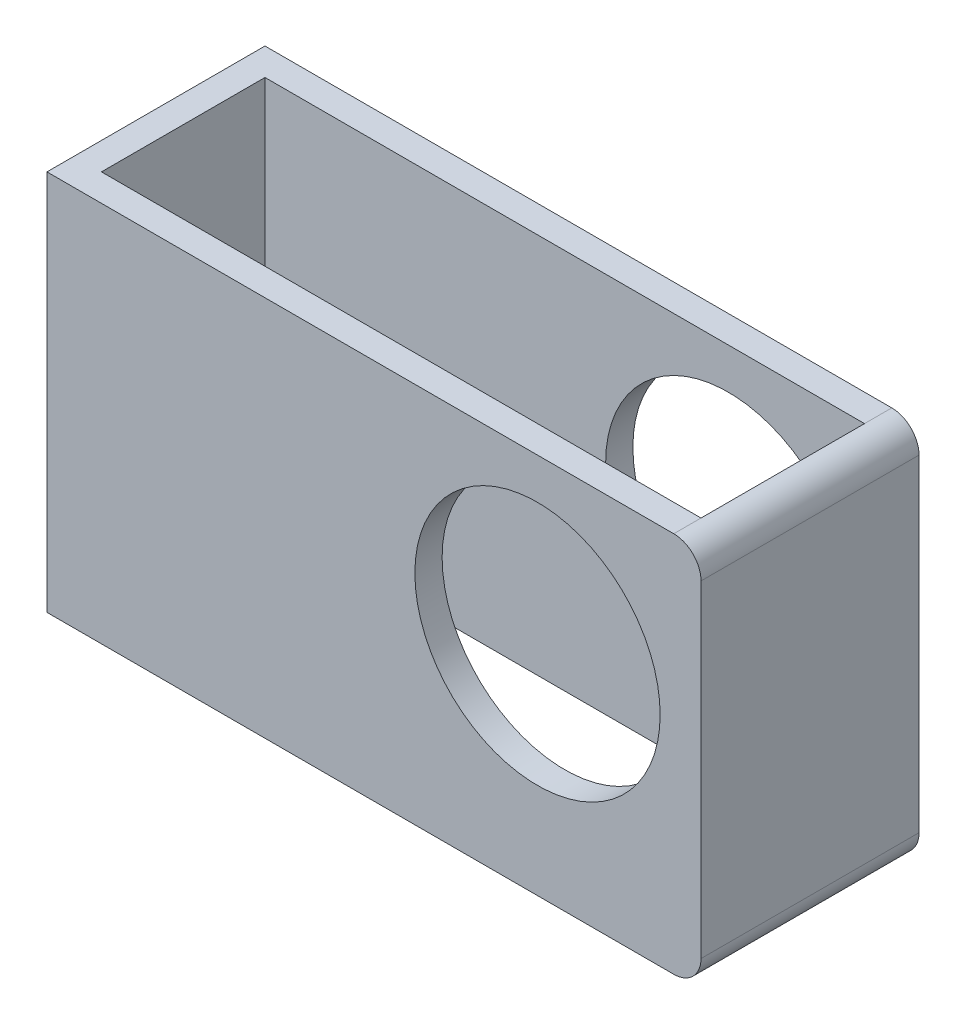
ISO-10303-21;
HEADER;
FILE_DESCRIPTION(('STEP AP214'),'2;1');
FILE_NAME('part.step','',(''),(''),'','','');
FILE_SCHEMA(('AUTOMOTIVE_DESIGN { 1 0 10303 214 1 1 1 1 }'));
ENDSEC;
DATA;
#1=APPLICATION_CONTEXT('core data for automotive mechanical design processes');
#2=APPLICATION_PROTOCOL_DEFINITION('international standard','automotive_design',2000,#1);
#3=PRODUCT_CONTEXT('',#1,'mechanical');
#4=PRODUCT('Part','Part','',(#3));
#5=PRODUCT_RELATED_PRODUCT_CATEGORY('part','',(#4));
#6=PRODUCT_DEFINITION_FORMATION('','',#4);
#7=PRODUCT_DEFINITION_CONTEXT('part definition',#1,'design');
#8=PRODUCT_DEFINITION('design','',#6,#7);
#9=PRODUCT_DEFINITION_SHAPE('','',#8);
#10=(LENGTH_UNIT() NAMED_UNIT(*) SI_UNIT(.MILLI.,.METRE.));
#11=(NAMED_UNIT(*) PLANE_ANGLE_UNIT() SI_UNIT($,.RADIAN.));
#12=(NAMED_UNIT(*) SI_UNIT($,.STERADIAN.) SOLID_ANGLE_UNIT());
#13=UNCERTAINTY_MEASURE_WITH_UNIT(LENGTH_MEASURE(1.E-05),#10,'distance_accuracy_value','');
#14=(GEOMETRIC_REPRESENTATION_CONTEXT(3) GLOBAL_UNCERTAINTY_ASSIGNED_CONTEXT((#13)) GLOBAL_UNIT_ASSIGNED_CONTEXT((#10,
#11,#12)) REPRESENTATION_CONTEXT('',''));
#15=CARTESIAN_POINT('',(0.,0.,0.));
#16=DIRECTION('',(0.,0.,1.));
#17=DIRECTION('',(1.,0.,0.));
#18=AXIS2_PLACEMENT_3D('',#15,#16,#17);
#19=CARTESIAN_POINT('',(-38.1,22.225,12.7));
#20=DIRECTION('',(1.,0.,0.));
#21=DIRECTION('',(0.,0.,-1.));
#22=AXIS2_PLACEMENT_3D('',#19,#20,#21);
#23=PLANE('',#22);
#24=CARTESIAN_POINT('',(-38.1,6.35000000000001,0.));
#25=DIRECTION('',(-1.,0.,0.));
#26=DIRECTION('',(0.,0.,1.));
#27=AXIS2_PLACEMENT_3D('',#24,#25,#26);
#28=CIRCLE('',#27,3.17499999999999);
#29=CARTESIAN_POINT('',(-38.1,6.35000000000001,3.17499999999999));
#30=VERTEX_POINT('',#29);
#31=EDGE_CURVE('E253',#30,#30,#28,.T.);
#32=ORIENTED_EDGE('',*,*,#31,.F.);
#33=EDGE_LOOP('',(#32));
#34=FACE_BOUND('',#33,.T.);
#35=DIRECTION('',(0.,-1.,0.));
#36=VECTOR('',#35,1.);
#37=CARTESIAN_POINT('',(-38.1,22.225,-12.7));
#38=LINE('',#37,#36);
#39=CARTESIAN_POINT('',(-38.1,22.225,-12.7));
#40=VERTEX_POINT('',#39);
#41=CARTESIAN_POINT('',(-38.1,-22.225,-12.7));
#42=VERTEX_POINT('',#41);
#43=EDGE_CURVE('E182',#40,#42,#38,.T.);
#44=ORIENTED_EDGE('',*,*,#43,.T.);
#45=DIRECTION('',(0.,0.,-1.));
#46=VECTOR('',#45,1.);
#47=CARTESIAN_POINT('',(-38.1,-22.225,12.7));
#48=LINE('',#47,#46);
#49=CARTESIAN_POINT('',(-38.1,-22.225,12.7));
#50=VERTEX_POINT('',#49);
#51=EDGE_CURVE('E177',#50,#42,#48,.T.);
#52=ORIENTED_EDGE('',*,*,#51,.F.);
#53=DIRECTION('',(0.,-1.,0.));
#54=VECTOR('',#53,1.);
#55=CARTESIAN_POINT('',(-38.1,22.225,12.7));
#56=LINE('',#55,#54);
#57=CARTESIAN_POINT('',(-38.1,22.225,12.7));
#58=VERTEX_POINT('',#57);
#59=EDGE_CURVE('E172',#58,#50,#56,.T.);
#60=ORIENTED_EDGE('',*,*,#59,.F.);
#61=DIRECTION('',(0.,0.,-1.));
#62=VECTOR('',#61,1.);
#63=CARTESIAN_POINT('',(-38.1,22.225,12.7));
#64=LINE('',#63,#62);
#65=EDGE_CURVE('E188',#58,#40,#64,.T.);
#66=ORIENTED_EDGE('',*,*,#65,.T.);
#67=EDGE_LOOP('',(#44,#52,#60,#66));
#68=FACE_BOUND('',#67,.T.);
#69=CARTESIAN_POINT('',(-38.1,-12.7,0.));
#70=DIRECTION('',(-1.,0.,0.));
#71=DIRECTION('',(0.,0.,1.));
#72=AXIS2_PLACEMENT_3D('',#69,#70,#71);
#73=CIRCLE('',#72,3.17499999999999);
#74=CARTESIAN_POINT('',(-38.1,-12.7,3.17499999999999));
#75=VERTEX_POINT('',#74);
#76=EDGE_CURVE('E247',#75,#75,#73,.T.);
#77=ORIENTED_EDGE('',*,*,#76,.F.);
#78=EDGE_LOOP('',(#77));
#79=FACE_BOUND('',#78,.T.);
#80=ADVANCED_FACE('F35',(#34,#68,#79),#23,.F.);
#81=CARTESIAN_POINT('',(19.05,3.175,12.7));
#82=DIRECTION('',(0.,0.,-1.));
#83=DIRECTION('',(-1.,0.,0.));
#84=AXIS2_PLACEMENT_3D('',#81,#82,#83);
#85=CYLINDRICAL_SURFACE('',#84,14.2875);
#86=CARTESIAN_POINT('',(19.05,3.175,-9.525));
#87=DIRECTION('',(0.,0.,-1.));
#88=DIRECTION('',(-1.,0.,0.));
#89=AXIS2_PLACEMENT_3D('',#86,#87,#88);
#90=CIRCLE('',#89,14.2875);
#91=CARTESIAN_POINT('',(4.7625,3.175,-9.525));
#92=VERTEX_POINT('',#91);
#93=EDGE_CURVE('E156',#92,#92,#90,.T.);
#94=ORIENTED_EDGE('',*,*,#93,.F.);
#95=EDGE_LOOP('',(#94));
#96=FACE_BOUND('',#95,.T.);
#97=CARTESIAN_POINT('',(19.05,3.175,-12.7));
#98=DIRECTION('',(0.,0.,1.));
#99=DIRECTION('',(1.,0.,0.));
#100=AXIS2_PLACEMENT_3D('',#97,#98,#99);
#101=CIRCLE('',#100,14.2875);
#102=CARTESIAN_POINT('',(33.3375,3.175,-12.7));
#103=VERTEX_POINT('',#102);
#104=EDGE_CURVE('E159',#103,#103,#101,.T.);
#105=ORIENTED_EDGE('',*,*,#104,.F.);
#106=EDGE_LOOP('',(#105));
#107=FACE_BOUND('',#106,.T.);
#108=ADVANCED_FACE('F242',(#96,#107),#85,.F.);
#109=CARTESIAN_POINT('',(0.,0.,12.7));
#110=DIRECTION('',(0.,0.,1.));
#111=DIRECTION('',(1.,0.,0.));
#112=AXIS2_PLACEMENT_3D('',#109,#110,#111);
#113=PLANE('',#112);
#114=DIRECTION('',(0.,1.,0.));
#115=VECTOR('',#114,1.);
#116=CARTESIAN_POINT('',(38.1,22.225,12.7));
#117=LINE('',#116,#115);
#118=CARTESIAN_POINT('',(38.1,-19.05,12.7));
#119=VERTEX_POINT('',#118);
#120=CARTESIAN_POINT('',(38.1,19.05,12.7));
#121=VERTEX_POINT('',#120);
#122=EDGE_CURVE('E166',#119,#121,#117,.T.);
#123=ORIENTED_EDGE('',*,*,#122,.T.);
#124=CARTESIAN_POINT('',(34.925,19.05,12.7));
#125=DIRECTION('',(0.,0.,1.));
#126=DIRECTION('',(1.,0.,0.));
#127=AXIS2_PLACEMENT_3D('',#124,#125,#126);
#128=CIRCLE('',#127,3.175);
#129=CARTESIAN_POINT('',(34.925,22.225,12.7));
#130=VERTEX_POINT('',#129);
#131=EDGE_CURVE('E203',#121,#130,#128,.T.);
#132=ORIENTED_EDGE('',*,*,#131,.T.);
#133=DIRECTION('',(-1.,0.,0.));
#134=VECTOR('',#133,1.);
#135=CARTESIAN_POINT('',(-38.1,22.225,12.7));
#136=LINE('',#135,#134);
#137=EDGE_CURVE('E169',#130,#58,#136,.T.);
#138=ORIENTED_EDGE('',*,*,#137,.T.);
#139=ORIENTED_EDGE('',*,*,#59,.T.);
#140=DIRECTION('',(1.,0.,0.));
#141=VECTOR('',#140,1.);
#142=CARTESIAN_POINT('',(-38.1,-22.225,12.7));
#143=LINE('',#142,#141);
#144=CARTESIAN_POINT('',(34.925,-22.225,12.7));
#145=VERTEX_POINT('',#144);
#146=EDGE_CURVE('E174',#50,#145,#143,.T.);
#147=ORIENTED_EDGE('',*,*,#146,.T.);
#148=CARTESIAN_POINT('',(34.925,-19.05,12.7));
#149=DIRECTION('',(0.,0.,1.));
#150=DIRECTION('',(1.,0.,0.));
#151=AXIS2_PLACEMENT_3D('',#148,#149,#150);
#152=CIRCLE('',#151,3.175);
#153=EDGE_CURVE('E202',#145,#119,#152,.T.);
#154=ORIENTED_EDGE('',*,*,#153,.T.);
#155=EDGE_LOOP('',(#123,#132,#138,#139,#147,#154));
#156=FACE_BOUND('',#155,.T.);
#157=CARTESIAN_POINT('',(19.05,3.175,12.7));
#158=DIRECTION('',(0.,0.,1.));
#159=DIRECTION('',(1.,0.,0.));
#160=AXIS2_PLACEMENT_3D('',#157,#158,#159);
#161=CIRCLE('',#160,14.2875);
#162=CARTESIAN_POINT('',(33.3375,3.175,12.7));
#163=VERTEX_POINT('',#162);
#164=EDGE_CURVE('E160',#163,#163,#161,.T.);
#165=ORIENTED_EDGE('',*,*,#164,.F.);
#166=EDGE_LOOP('',(#165));
#167=FACE_BOUND('',#166,.T.);
#168=ADVANCED_FACE('F213',(#156,#167),#113,.T.);
#169=CARTESIAN_POINT('',(0.,0.,-12.7));
#170=DIRECTION('',(0.,0.,1.));
#171=DIRECTION('',(1.,0.,0.));
#172=AXIS2_PLACEMENT_3D('',#169,#170,#171);
#173=PLANE('',#172);
#174=DIRECTION('',(-1.,0.,0.));
#175=VECTOR('',#174,1.);
#176=CARTESIAN_POINT('',(-38.1,22.225,-12.7));
#177=LINE('',#176,#175);
#178=CARTESIAN_POINT('',(34.925,22.225,-12.7));
#179=VERTEX_POINT('',#178);
#180=EDGE_CURVE('E180',#179,#40,#177,.T.);
#181=ORIENTED_EDGE('',*,*,#180,.F.);
#182=CARTESIAN_POINT('',(34.925,19.05,-12.7));
#183=DIRECTION('',(0.,0.,1.));
#184=DIRECTION('',(1.,0.,0.));
#185=AXIS2_PLACEMENT_3D('',#182,#183,#184);
#186=CIRCLE('',#185,3.175);
#187=CARTESIAN_POINT('',(38.1,19.05,-12.7));
#188=VERTEX_POINT('',#187);
#189=EDGE_CURVE('E195',#179,#188,#186,.F.);
#190=ORIENTED_EDGE('',*,*,#189,.T.);
#191=DIRECTION('',(0.,1.,0.));
#192=VECTOR('',#191,1.);
#193=CARTESIAN_POINT('',(38.1,22.225,-12.7));
#194=LINE('',#193,#192);
#195=CARTESIAN_POINT('',(38.1,-19.05,-12.7));
#196=VERTEX_POINT('',#195);
#197=EDGE_CURVE('E163',#196,#188,#194,.T.);
#198=ORIENTED_EDGE('',*,*,#197,.F.);
#199=CARTESIAN_POINT('',(34.925,-19.05,-12.7));
#200=DIRECTION('',(0.,0.,1.));
#201=DIRECTION('',(1.,0.,0.));
#202=AXIS2_PLACEMENT_3D('',#199,#200,#201);
#203=CIRCLE('',#202,3.175);
#204=CARTESIAN_POINT('',(34.925,-22.225,-12.7));
#205=VERTEX_POINT('',#204);
#206=EDGE_CURVE('E193',#196,#205,#203,.F.);
#207=ORIENTED_EDGE('',*,*,#206,.T.);
#208=DIRECTION('',(1.,0.,0.));
#209=VECTOR('',#208,1.);
#210=CARTESIAN_POINT('',(-38.1,-22.225,-12.7));
#211=LINE('',#210,#209);
#212=EDGE_CURVE('E170',#42,#205,#211,.T.);
#213=ORIENTED_EDGE('',*,*,#212,.F.);
#214=ORIENTED_EDGE('',*,*,#43,.F.);
#215=EDGE_LOOP('',(#181,#190,#198,#207,#213,#214));
#216=FACE_BOUND('',#215,.T.);
#217=ORIENTED_EDGE('',*,*,#104,.T.);
#218=EDGE_LOOP('',(#217));
#219=FACE_BOUND('',#218,.T.);
#220=ADVANCED_FACE('F226',(#216,#219),#173,.F.);
#221=CARTESIAN_POINT('',(38.1,22.225,12.7));
#222=DIRECTION('',(-1.,0.,0.));
#223=DIRECTION('',(0.,0.,1.));
#224=AXIS2_PLACEMENT_3D('',#221,#222,#223);
#225=PLANE('',#224);
#226=ORIENTED_EDGE('',*,*,#197,.T.);
#227=DIRECTION('',(0.,0.,-1.));
#228=VECTOR('',#227,1.);
#229=CARTESIAN_POINT('',(38.1,19.05,12.7));
#230=LINE('',#229,#228);
#231=EDGE_CURVE('E200',#188,#121,#230,.F.);
#232=ORIENTED_EDGE('',*,*,#231,.T.);
#233=ORIENTED_EDGE('',*,*,#122,.F.);
#234=DIRECTION('',(0.,0.,-1.));
#235=VECTOR('',#234,1.);
#236=CARTESIAN_POINT('',(38.1,-19.05,12.7));
#237=LINE('',#236,#235);
#238=EDGE_CURVE('E197',#119,#196,#237,.T.);
#239=ORIENTED_EDGE('',*,*,#238,.T.);
#240=EDGE_LOOP('',(#226,#232,#233,#239));
#241=FACE_BOUND('',#240,.T.);
#242=ADVANCED_FACE('F222',(#241),#225,.F.);
#243=CARTESIAN_POINT('',(-38.1,22.225,12.7));
#244=DIRECTION('',(0.,-1.,0.));
#245=DIRECTION('',(0.,0.,-1.));
#246=AXIS2_PLACEMENT_3D('',#243,#244,#245);
#247=PLANE('',#246);
#248=DIRECTION('',(0.,0.,-1.));
#249=VECTOR('',#248,1.);
#250=CARTESIAN_POINT('',(-34.925,22.225,9.525));
#251=LINE('',#250,#249);
#252=CARTESIAN_POINT('',(-34.925,22.225,9.525));
#253=VERTEX_POINT('',#252);
#254=CARTESIAN_POINT('',(-34.925,22.225,-9.525));
#255=VERTEX_POINT('',#254);
#256=EDGE_CURVE('E122',#253,#255,#251,.T.);
#257=ORIENTED_EDGE('',*,*,#256,.T.);
#258=DIRECTION('',(1.,0.,0.));
#259=VECTOR('',#258,1.);
#260=CARTESIAN_POINT('',(-34.925,22.225,-9.525));
#261=LINE('',#260,#259);
#262=CARTESIAN_POINT('',(34.925,22.225,-9.525));
#263=VERTEX_POINT('',#262);
#264=EDGE_CURVE('E127',#255,#263,#261,.T.);
#265=ORIENTED_EDGE('',*,*,#264,.T.);
#266=DIRECTION('',(0.,0.,-1.));
#267=VECTOR('',#266,1.);
#268=CARTESIAN_POINT('',(34.925,22.225,12.7));
#269=LINE('',#268,#267);
#270=EDGE_CURVE('E191',#263,#179,#269,.T.);
#271=ORIENTED_EDGE('',*,*,#270,.T.);
#272=ORIENTED_EDGE('',*,*,#180,.T.);
#273=ORIENTED_EDGE('',*,*,#65,.F.);
#274=ORIENTED_EDGE('',*,*,#137,.F.);
#275=CARTESIAN_POINT('',(34.925,22.225,9.525));
#276=VERTEX_POINT('',#275);
#277=EDGE_CURVE('E133',#130,#276,#269,.T.);
#278=ORIENTED_EDGE('',*,*,#277,.T.);
#279=DIRECTION('',(-1.,0.,0.));
#280=VECTOR('',#279,1.);
#281=CARTESIAN_POINT('',(34.925,22.225,9.525));
#282=LINE('',#281,#280);
#283=EDGE_CURVE('E50',#276,#253,#282,.T.);
#284=ORIENTED_EDGE('',*,*,#283,.T.);
#285=EDGE_LOOP('',(#257,#265,#271,#272,#273,#274,#278,#284));
#286=FACE_BOUND('',#285,.T.);
#287=ADVANCED_FACE('F130',(#286),#247,.F.);
#288=CARTESIAN_POINT('',(-38.1,-22.225,12.7));
#289=DIRECTION('',(0.,1.,0.));
#290=DIRECTION('',(0.,0.,1.));
#291=AXIS2_PLACEMENT_3D('',#288,#289,#290);
#292=PLANE('',#291);
#293=DIRECTION('',(0.,0.,-1.));
#294=VECTOR('',#293,1.);
#295=CARTESIAN_POINT('',(34.925,-22.225,12.7));
#296=LINE('',#295,#294);
#297=CARTESIAN_POINT('',(34.925,-22.225,-9.525));
#298=VERTEX_POINT('',#297);
#299=EDGE_CURVE('E11',#205,#298,#296,.F.);
#300=ORIENTED_EDGE('',*,*,#299,.T.);
#301=DIRECTION('',(1.,0.,0.));
#302=VECTOR('',#301,1.);
#303=CARTESIAN_POINT('',(-34.925,-22.225,-9.525));
#304=LINE('',#303,#302);
#305=CARTESIAN_POINT('',(-34.925,-22.225,-9.525));
#306=VERTEX_POINT('',#305);
#307=EDGE_CURVE('E58',#306,#298,#304,.T.);
#308=ORIENTED_EDGE('',*,*,#307,.F.);
#309=DIRECTION('',(0.,0.,-1.));
#310=VECTOR('',#309,1.);
#311=CARTESIAN_POINT('',(-34.925,-22.225,9.525));
#312=LINE('',#311,#310);
#313=CARTESIAN_POINT('',(-34.925,-22.225,9.525));
#314=VERTEX_POINT('',#313);
#315=EDGE_CURVE('E146',#314,#306,#312,.T.);
#316=ORIENTED_EDGE('',*,*,#315,.F.);
#317=DIRECTION('',(-1.,0.,0.));
#318=VECTOR('',#317,1.);
#319=CARTESIAN_POINT('',(34.925,-22.225,9.525));
#320=LINE('',#319,#318);
#321=CARTESIAN_POINT('',(34.925,-22.225,9.525));
#322=VERTEX_POINT('',#321);
#323=EDGE_CURVE('E114',#322,#314,#320,.T.);
#324=ORIENTED_EDGE('',*,*,#323,.F.);
#325=EDGE_CURVE('E43',#322,#145,#296,.F.);
#326=ORIENTED_EDGE('',*,*,#325,.T.);
#327=ORIENTED_EDGE('',*,*,#146,.F.);
#328=ORIENTED_EDGE('',*,*,#51,.T.);
#329=ORIENTED_EDGE('',*,*,#212,.T.);
#330=EDGE_LOOP('',(#300,#308,#316,#324,#326,#327,#328,#329));
#331=FACE_BOUND('',#330,.T.);
#332=ADVANCED_FACE('F209',(#331),#292,.F.);
#333=CARTESIAN_POINT('',(19.05,3.175,9.525));
#334=DIRECTION('',(0.,0.,1.));
#335=DIRECTION('',(1.,0.,0.));
#336=AXIS2_PLACEMENT_3D('',#333,#334,#335);
#337=CIRCLE('',#336,14.2875);
#338=CARTESIAN_POINT('',(33.3375,3.175,9.525));
#339=VERTEX_POINT('',#338);
#340=EDGE_CURVE('E151',#339,#339,#337,.T.);
#341=ORIENTED_EDGE('',*,*,#340,.F.);
#342=EDGE_LOOP('',(#341));
#343=FACE_BOUND('',#342,.T.);
#344=ORIENTED_EDGE('',*,*,#164,.T.);
#345=EDGE_LOOP('',(#344));
#346=FACE_BOUND('',#345,.T.);
#347=ADVANCED_FACE('F284',(#343,#346),#85,.F.);
#348=CARTESIAN_POINT('',(34.925,19.05,12.7));
#349=DIRECTION('',(0.,0.,-1.));
#350=DIRECTION('',(-1.,0.,0.));
#351=AXIS2_PLACEMENT_3D('',#348,#349,#350);
#352=CYLINDRICAL_SURFACE('',#351,3.175);
#353=ORIENTED_EDGE('',*,*,#131,.F.);
#354=ORIENTED_EDGE('',*,*,#231,.F.);
#355=ORIENTED_EDGE('',*,*,#189,.F.);
#356=ORIENTED_EDGE('',*,*,#270,.F.);
#357=DIRECTION('',(0.,0.,1.));
#358=VECTOR('',#357,1.);
#359=CARTESIAN_POINT('',(34.925,22.225,-9.525));
#360=LINE('',#359,#358);
#361=EDGE_CURVE('E134',#263,#276,#360,.T.);
#362=ORIENTED_EDGE('',*,*,#361,.T.);
#363=ORIENTED_EDGE('',*,*,#277,.F.);
#364=EDGE_LOOP('',(#353,#354,#355,#356,#362,#363));
#365=FACE_BOUND('',#364,.T.);
#366=ADVANCED_FACE('F233',(#365),#352,.T.);
#367=CARTESIAN_POINT('',(34.925,-19.05,12.7));
#368=DIRECTION('',(0.,0.,-1.));
#369=DIRECTION('',(-1.,0.,0.));
#370=AXIS2_PLACEMENT_3D('',#367,#368,#369);
#371=CYLINDRICAL_SURFACE('',#370,3.175);
#372=ORIENTED_EDGE('',*,*,#153,.F.);
#373=ORIENTED_EDGE('',*,*,#325,.F.);
#374=DIRECTION('',(0.,0.,1.));
#375=VECTOR('',#374,1.);
#376=CARTESIAN_POINT('',(34.925,-22.225,-9.525));
#377=LINE('',#376,#375);
#378=EDGE_CURVE('E141',#298,#322,#377,.T.);
#379=ORIENTED_EDGE('',*,*,#378,.F.);
#380=ORIENTED_EDGE('',*,*,#299,.F.);
#381=ORIENTED_EDGE('',*,*,#206,.F.);
#382=ORIENTED_EDGE('',*,*,#238,.F.);
#383=EDGE_LOOP('',(#372,#373,#379,#380,#381,#382));
#384=FACE_BOUND('',#383,.T.);
#385=ADVANCED_FACE('F37',(#384),#371,.T.);
#386=CARTESIAN_POINT('',(34.925,22.225,-9.525));
#387=DIRECTION('',(1.,0.,0.));
#388=DIRECTION('',(0.,0.,-1.));
#389=AXIS2_PLACEMENT_3D('',#386,#387,#388);
#390=PLANE('',#389);
#391=ORIENTED_EDGE('',*,*,#378,.T.);
#392=DIRECTION('',(0.,-1.,0.));
#393=VECTOR('',#392,1.);
#394=CARTESIAN_POINT('',(34.925,22.225,9.525));
#395=LINE('',#394,#393);
#396=EDGE_CURVE('E119',#276,#322,#395,.T.);
#397=ORIENTED_EDGE('',*,*,#396,.F.);
#398=ORIENTED_EDGE('',*,*,#361,.F.);
#399=DIRECTION('',(0.,-1.,0.));
#400=VECTOR('',#399,1.);
#401=CARTESIAN_POINT('',(34.925,22.225,-9.525));
#402=LINE('',#401,#400);
#403=EDGE_CURVE('E149',#263,#298,#402,.T.);
#404=ORIENTED_EDGE('',*,*,#403,.T.);
#405=EDGE_LOOP('',(#391,#397,#398,#404));
#406=FACE_BOUND('',#405,.T.);
#407=ADVANCED_FACE('F236',(#406),#390,.F.);
#408=CARTESIAN_POINT('',(-34.925,22.225,-9.525));
#409=DIRECTION('',(0.,0.,-1.));
#410=DIRECTION('',(-1.,0.,0.));
#411=AXIS2_PLACEMENT_3D('',#408,#409,#410);
#412=PLANE('',#411);
#413=ORIENTED_EDGE('',*,*,#93,.T.);
#414=EDGE_LOOP('',(#413));
#415=FACE_BOUND('',#414,.T.);
#416=ORIENTED_EDGE('',*,*,#307,.T.);
#417=ORIENTED_EDGE('',*,*,#403,.F.);
#418=ORIENTED_EDGE('',*,*,#264,.F.);
#419=DIRECTION('',(0.,-1.,0.));
#420=VECTOR('',#419,1.);
#421=CARTESIAN_POINT('',(-34.925,22.225,-9.525));
#422=LINE('',#421,#420);
#423=EDGE_CURVE('E118',#255,#306,#422,.T.);
#424=ORIENTED_EDGE('',*,*,#423,.T.);
#425=EDGE_LOOP('',(#416,#417,#418,#424));
#426=FACE_BOUND('',#425,.T.);
#427=ADVANCED_FACE('F237',(#415,#426),#412,.F.);
#428=CARTESIAN_POINT('',(-34.925,22.225,9.525));
#429=DIRECTION('',(-1.,0.,0.));
#430=DIRECTION('',(0.,0.,1.));
#431=AXIS2_PLACEMENT_3D('',#428,#429,#430);
#432=PLANE('',#431);
#433=CARTESIAN_POINT('',(-34.925,6.35000000000001,0.));
#434=DIRECTION('',(-1.,0.,0.));
#435=DIRECTION('',(0.,0.,1.));
#436=AXIS2_PLACEMENT_3D('',#433,#434,#435);
#437=CIRCLE('',#436,3.17499999999999);
#438=CARTESIAN_POINT('',(-34.925,6.35000000000001,3.17499999999999));
#439=VERTEX_POINT('',#438);
#440=EDGE_CURVE('E249',#439,#439,#437,.T.);
#441=ORIENTED_EDGE('',*,*,#440,.T.);
#442=EDGE_LOOP('',(#441));
#443=FACE_BOUND('',#442,.T.);
#444=CARTESIAN_POINT('',(-34.925,-12.7,0.));
#445=DIRECTION('',(-1.,0.,0.));
#446=DIRECTION('',(0.,0.,1.));
#447=AXIS2_PLACEMENT_3D('',#444,#445,#446);
#448=CIRCLE('',#447,3.17499999999999);
#449=CARTESIAN_POINT('',(-34.925,-12.7,3.17499999999999));
#450=VERTEX_POINT('',#449);
#451=EDGE_CURVE('E144',#450,#450,#448,.T.);
#452=ORIENTED_EDGE('',*,*,#451,.T.);
#453=EDGE_LOOP('',(#452));
#454=FACE_BOUND('',#453,.T.);
#455=ORIENTED_EDGE('',*,*,#315,.T.);
#456=ORIENTED_EDGE('',*,*,#423,.F.);
#457=ORIENTED_EDGE('',*,*,#256,.F.);
#458=DIRECTION('',(0.,-1.,0.));
#459=VECTOR('',#458,1.);
#460=CARTESIAN_POINT('',(-34.925,22.225,9.525));
#461=LINE('',#460,#459);
#462=EDGE_CURVE('E110',#253,#314,#461,.T.);
#463=ORIENTED_EDGE('',*,*,#462,.T.);
#464=EDGE_LOOP('',(#455,#456,#457,#463));
#465=FACE_BOUND('',#464,.T.);
#466=ADVANCED_FACE('F123',(#443,#454,#465),#432,.F.);
#467=CARTESIAN_POINT('',(34.925,22.225,9.525));
#468=DIRECTION('',(0.,0.,1.));
#469=DIRECTION('',(1.,0.,0.));
#470=AXIS2_PLACEMENT_3D('',#467,#468,#469);
#471=PLANE('',#470);
#472=ORIENTED_EDGE('',*,*,#340,.T.);
#473=EDGE_LOOP('',(#472));
#474=FACE_BOUND('',#473,.T.);
#475=ORIENTED_EDGE('',*,*,#323,.T.);
#476=ORIENTED_EDGE('',*,*,#462,.F.);
#477=ORIENTED_EDGE('',*,*,#283,.F.);
#478=ORIENTED_EDGE('',*,*,#396,.T.);
#479=EDGE_LOOP('',(#475,#476,#477,#478));
#480=FACE_BOUND('',#479,.T.);
#481=ADVANCED_FACE('F112',(#474,#480),#471,.F.);
#482=CARTESIAN_POINT('',(-38.1,-12.7,0.));
#483=DIRECTION('',(-1.,0.,0.));
#484=DIRECTION('',(0.,0.,1.));
#485=AXIS2_PLACEMENT_3D('',#482,#483,#484);
#486=CYLINDRICAL_SURFACE('',#485,3.17499999999999);
#487=ORIENTED_EDGE('',*,*,#76,.T.);
#488=EDGE_LOOP('',(#487));
#489=FACE_BOUND('',#488,.T.);
#490=ORIENTED_EDGE('',*,*,#451,.F.);
#491=EDGE_LOOP('',(#490));
#492=FACE_BOUND('',#491,.T.);
#493=ADVANCED_FACE('F262',(#489,#492),#486,.F.);
#494=CARTESIAN_POINT('',(-38.1,6.35000000000001,0.));
#495=DIRECTION('',(-1.,0.,0.));
#496=DIRECTION('',(0.,0.,1.));
#497=AXIS2_PLACEMENT_3D('',#494,#495,#496);
#498=CYLINDRICAL_SURFACE('',#497,3.17499999999999);
#499=ORIENTED_EDGE('',*,*,#31,.T.);
#500=EDGE_LOOP('',(#499));
#501=FACE_BOUND('',#500,.T.);
#502=ORIENTED_EDGE('',*,*,#440,.F.);
#503=EDGE_LOOP('',(#502));
#504=FACE_BOUND('',#503,.T.);
#505=ADVANCED_FACE('F259',(#501,#504),#498,.F.);
#506=CLOSED_SHELL('',(#80,#108,#168,#220,#242,#287,#332,#347,#366,#385,#407,#427,#466,#481,#493,#505));
#507=MANIFOLD_SOLID_BREP('B2',#506);
#508=ADVANCED_BREP_SHAPE_REPRESENTATION('',(#18,#507),#14);
#509=SHAPE_DEFINITION_REPRESENTATION(#9,#508);
ENDSEC;
END-ISO-10303-21;
